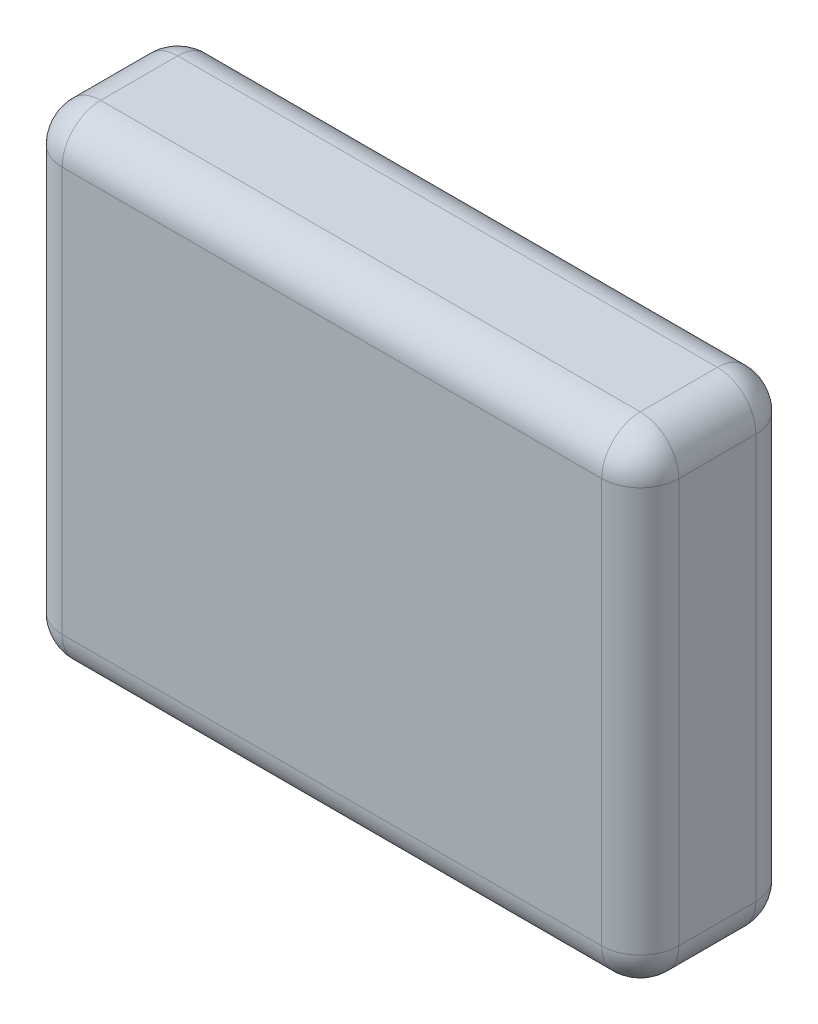
ISO-10303-21;
HEADER;
FILE_DESCRIPTION(('STEP AP214'),'2;1');
FILE_NAME('part.step','',(''),(''),'','','');
FILE_SCHEMA(('AUTOMOTIVE_DESIGN { 1 0 10303 214 1 1 1 1 }'));
ENDSEC;
DATA;
#1=APPLICATION_CONTEXT('core data for automotive mechanical design processes');
#2=APPLICATION_PROTOCOL_DEFINITION('international standard','automotive_design',2000,#1);
#3=PRODUCT_CONTEXT('',#1,'mechanical');
#4=PRODUCT('Part','Part','',(#3));
#5=PRODUCT_RELATED_PRODUCT_CATEGORY('part','',(#4));
#6=PRODUCT_DEFINITION_FORMATION('','',#4);
#7=PRODUCT_DEFINITION_CONTEXT('part definition',#1,'design');
#8=PRODUCT_DEFINITION('design','',#6,#7);
#9=PRODUCT_DEFINITION_SHAPE('','',#8);
#10=(LENGTH_UNIT() NAMED_UNIT(*) SI_UNIT(.MILLI.,.METRE.));
#11=(NAMED_UNIT(*) PLANE_ANGLE_UNIT() SI_UNIT($,.RADIAN.));
#12=(NAMED_UNIT(*) SI_UNIT($,.STERADIAN.) SOLID_ANGLE_UNIT());
#13=UNCERTAINTY_MEASURE_WITH_UNIT(LENGTH_MEASURE(1.E-05),#10,'distance_accuracy_value','');
#14=(GEOMETRIC_REPRESENTATION_CONTEXT(3) GLOBAL_UNCERTAINTY_ASSIGNED_CONTEXT((#13)) GLOBAL_UNIT_ASSIGNED_CONTEXT((#10,
#11,#12)) REPRESENTATION_CONTEXT('',''));
#15=CARTESIAN_POINT('',(0.,0.,0.));
#16=DIRECTION('',(0.,0.,1.));
#17=DIRECTION('',(1.,0.,0.));
#18=AXIS2_PLACEMENT_3D('',#15,#16,#17);
#19=CARTESIAN_POINT('',(14.,18.5,12.));
#20=DIRECTION('',(0.,-1.,0.));
#21=DIRECTION('',(1.,0.,0.));
#22=AXIS2_PLACEMENT_3D('',#19,#20,#21);
#23=SPHERICAL_SURFACE('',#22,2.);
#24=CARTESIAN_POINT('',(14.,18.5,12.));
#25=DIRECTION('',(0.,0.,-1.));
#26=DIRECTION('',(1.,0.,0.));
#27=AXIS2_PLACEMENT_3D('',#24,#25,#26);
#28=CIRCLE('',#27,2.);
#29=CARTESIAN_POINT('',(14.,20.5,12.));
#30=VERTEX_POINT('',#29);
#31=CARTESIAN_POINT('',(16.,18.5,12.));
#32=VERTEX_POINT('',#31);
#33=EDGE_CURVE('E10',#30,#32,#28,.T.);
#34=ORIENTED_EDGE('',*,*,#33,.F.);
#35=CARTESIAN_POINT('',(14.,18.5,12.));
#36=DIRECTION('',(1.,0.,0.));
#37=DIRECTION('',(0.,0.,1.));
#38=AXIS2_PLACEMENT_3D('',#35,#36,#37);
#39=CIRCLE('',#38,2.);
#40=CARTESIAN_POINT('',(14.,18.5,14.));
#41=VERTEX_POINT('',#40);
#42=EDGE_CURVE('E228',#30,#41,#39,.T.);
#43=ORIENTED_EDGE('',*,*,#42,.T.);
#44=CARTESIAN_POINT('',(14.,18.5,12.));
#45=DIRECTION('',(0.,-1.,0.));
#46=DIRECTION('',(1.,0.,0.));
#47=AXIS2_PLACEMENT_3D('',#44,#45,#46);
#48=CIRCLE('',#47,2.);
#49=EDGE_CURVE('E236',#32,#41,#48,.T.);
#50=ORIENTED_EDGE('',*,*,#49,.F.);
#51=EDGE_LOOP('',(#34,#43,#50));
#52=FACE_BOUND('',#51,.T.);
#53=ADVANCED_FACE('F16',(#52),#23,.T.);
#54=CARTESIAN_POINT('',(14.,18.5,8.));
#55=DIRECTION('',(0.,0.,1.));
#56=DIRECTION('',(1.,0.,0.));
#57=AXIS2_PLACEMENT_3D('',#54,#55,#56);
#58=SPHERICAL_SURFACE('',#57,2.);
#59=CARTESIAN_POINT('',(14.,18.5,8.));
#60=DIRECTION('',(0.,-1.,0.));
#61=DIRECTION('',(1.,0.,0.));
#62=AXIS2_PLACEMENT_3D('',#59,#60,#61);
#63=CIRCLE('',#62,2.);
#64=CARTESIAN_POINT('',(14.,18.5,6.));
#65=VERTEX_POINT('',#64);
#66=CARTESIAN_POINT('',(16.,18.5,8.));
#67=VERTEX_POINT('',#66);
#68=EDGE_CURVE('E130',#65,#67,#63,.T.);
#69=ORIENTED_EDGE('',*,*,#68,.F.);
#70=CARTESIAN_POINT('',(14.,18.5,8.));
#71=DIRECTION('',(1.,0.,0.));
#72=DIRECTION('',(0.,1.,0.));
#73=AXIS2_PLACEMENT_3D('',#70,#71,#72);
#74=CIRCLE('',#73,2.);
#75=CARTESIAN_POINT('',(14.,20.5,8.));
#76=VERTEX_POINT('',#75);
#77=EDGE_CURVE('E133',#65,#76,#74,.T.);
#78=ORIENTED_EDGE('',*,*,#77,.T.);
#79=CARTESIAN_POINT('',(14.,18.5,8.));
#80=DIRECTION('',(0.,0.,1.));
#81=DIRECTION('',(1.,0.,0.));
#82=AXIS2_PLACEMENT_3D('',#79,#80,#81);
#83=CIRCLE('',#82,2.);
#84=EDGE_CURVE('E24',#67,#76,#83,.T.);
#85=ORIENTED_EDGE('',*,*,#84,.F.);
#86=EDGE_LOOP('',(#69,#78,#85));
#87=FACE_BOUND('',#86,.T.);
#88=ADVANCED_FACE('F132',(#87),#58,.T.);
#89=CARTESIAN_POINT('',(16.,-4.5,6.));
#90=DIRECTION('',(1.,0.,0.));
#91=DIRECTION('',(0.,1.,0.));
#92=AXIS2_PLACEMENT_3D('',#89,#90,#91);
#93=PLANE('',#92);
#94=DIRECTION('',(0.,0.,1.));
#95=VECTOR('',#94,1.);
#96=CARTESIAN_POINT('',(16.,-2.5,6.));
#97=LINE('',#96,#95);
#98=CARTESIAN_POINT('',(16.,-2.5,8.));
#99=VERTEX_POINT('',#98);
#100=CARTESIAN_POINT('',(16.,-2.5,12.));
#101=VERTEX_POINT('',#100);
#102=EDGE_CURVE('E151',#99,#101,#97,.T.);
#103=ORIENTED_EDGE('',*,*,#102,.F.);
#104=DIRECTION('',(0.,1.,0.));
#105=VECTOR('',#104,1.);
#106=CARTESIAN_POINT('',(16.,-4.5,8.));
#107=LINE('',#106,#105);
#108=EDGE_CURVE('E138',#99,#67,#107,.T.);
#109=ORIENTED_EDGE('',*,*,#108,.T.);
#110=DIRECTION('',(0.,0.,1.));
#111=VECTOR('',#110,1.);
#112=CARTESIAN_POINT('',(16.,18.5,6.));
#113=LINE('',#112,#111);
#114=EDGE_CURVE('E241',#67,#32,#113,.T.);
#115=ORIENTED_EDGE('',*,*,#114,.T.);
#116=DIRECTION('',(0.,1.,0.));
#117=VECTOR('',#116,1.);
#118=CARTESIAN_POINT('',(16.,-4.5,12.));
#119=LINE('',#118,#117);
#120=EDGE_CURVE('E232',#101,#32,#119,.T.);
#121=ORIENTED_EDGE('',*,*,#120,.F.);
#122=EDGE_LOOP('',(#103,#109,#115,#121));
#123=FACE_BOUND('',#122,.T.);
#124=ADVANCED_FACE('F379',(#123),#93,.T.);
#125=CARTESIAN_POINT('',(14.,-2.5,12.));
#126=DIRECTION('',(0.,0.,-1.));
#127=DIRECTION('',(1.,0.,0.));
#128=AXIS2_PLACEMENT_3D('',#125,#126,#127);
#129=SPHERICAL_SURFACE('',#128,2.);
#130=CARTESIAN_POINT('',(14.,-2.5,12.));
#131=DIRECTION('',(0.,1.,0.));
#132=DIRECTION('',(1.,0.,0.));
#133=AXIS2_PLACEMENT_3D('',#130,#131,#132);
#134=CIRCLE('',#133,2.);
#135=CARTESIAN_POINT('',(14.,-2.5,14.));
#136=VERTEX_POINT('',#135);
#137=EDGE_CURVE('E239',#136,#101,#134,.T.);
#138=ORIENTED_EDGE('',*,*,#137,.F.);
#139=CARTESIAN_POINT('',(14.,-2.5,12.));
#140=DIRECTION('',(1.,0.,0.));
#141=DIRECTION('',(0.,-1.,0.));
#142=AXIS2_PLACEMENT_3D('',#139,#140,#141);
#143=CIRCLE('',#142,2.);
#144=CARTESIAN_POINT('',(14.,-4.5,12.));
#145=VERTEX_POINT('',#144);
#146=EDGE_CURVE('E210',#136,#145,#143,.T.);
#147=ORIENTED_EDGE('',*,*,#146,.T.);
#148=CARTESIAN_POINT('',(14.,-2.5,12.));
#149=DIRECTION('',(0.,0.,-1.));
#150=DIRECTION('',(1.,0.,0.));
#151=AXIS2_PLACEMENT_3D('',#148,#149,#150);
#152=CIRCLE('',#151,2.);
#153=EDGE_CURVE('E214',#101,#145,#152,.T.);
#154=ORIENTED_EDGE('',*,*,#153,.F.);
#155=EDGE_LOOP('',(#138,#147,#154));
#156=FACE_BOUND('',#155,.T.);
#157=ADVANCED_FACE('F306',(#156),#129,.T.);
#158=CARTESIAN_POINT('',(14.,-2.5,8.));
#159=DIRECTION('',(0.,0.,1.));
#160=DIRECTION('',(1.,0.,0.));
#161=AXIS2_PLACEMENT_3D('',#158,#159,#160);
#162=SPHERICAL_SURFACE('',#161,2.);
#163=CARTESIAN_POINT('',(14.,-2.5,8.));
#164=DIRECTION('',(0.,0.,-1.));
#165=DIRECTION('',(1.,0.,0.));
#166=AXIS2_PLACEMENT_3D('',#163,#164,#165);
#167=CIRCLE('',#166,2.);
#168=CARTESIAN_POINT('',(14.,-4.5,8.));
#169=VERTEX_POINT('',#168);
#170=EDGE_CURVE('E217',#99,#169,#167,.T.);
#171=ORIENTED_EDGE('',*,*,#170,.T.);
#172=CARTESIAN_POINT('',(14.,-2.5,8.));
#173=DIRECTION('',(-1.,0.,0.));
#174=DIRECTION('',(0.,-1.,0.));
#175=AXIS2_PLACEMENT_3D('',#172,#173,#174);
#176=CIRCLE('',#175,2.);
#177=CARTESIAN_POINT('',(14.,-2.5,6.));
#178=VERTEX_POINT('',#177);
#179=EDGE_CURVE('E206',#178,#169,#176,.T.);
#180=ORIENTED_EDGE('',*,*,#179,.F.);
#181=CARTESIAN_POINT('',(14.,-2.5,8.));
#182=DIRECTION('',(0.,-1.,0.));
#183=DIRECTION('',(1.,0.,0.));
#184=AXIS2_PLACEMENT_3D('',#181,#182,#183);
#185=CIRCLE('',#184,2.);
#186=EDGE_CURVE('E139',#178,#99,#185,.T.);
#187=ORIENTED_EDGE('',*,*,#186,.T.);
#188=EDGE_LOOP('',(#171,#180,#187));
#189=FACE_BOUND('',#188,.T.);
#190=ADVANCED_FACE('F378',(#189),#162,.T.);
#191=CARTESIAN_POINT('',(14.,18.5,6.));
#192=DIRECTION('',(0.,0.,1.));
#193=DIRECTION('',(1.,0.,0.));
#194=AXIS2_PLACEMENT_3D('',#191,#192,#193);
#195=CYLINDRICAL_SURFACE('',#194,2.);
#196=ORIENTED_EDGE('',*,*,#114,.F.);
#197=ORIENTED_EDGE('',*,*,#84,.T.);
#198=DIRECTION('',(0.,0.,1.));
#199=VECTOR('',#198,1.);
#200=CARTESIAN_POINT('',(14.,20.5,6.));
#201=LINE('',#200,#199);
#202=EDGE_CURVE('E201',#76,#30,#201,.T.);
#203=ORIENTED_EDGE('',*,*,#202,.T.);
#204=ORIENTED_EDGE('',*,*,#33,.T.);
#205=EDGE_LOOP('',(#196,#197,#203,#204));
#206=FACE_BOUND('',#205,.T.);
#207=ADVANCED_FACE('F453',(#206),#195,.T.);
#208=CARTESIAN_POINT('',(14.,-4.5,12.));
#209=DIRECTION('',(0.,1.,0.));
#210=DIRECTION('',(1.,0.,0.));
#211=AXIS2_PLACEMENT_3D('',#208,#209,#210);
#212=CYLINDRICAL_SURFACE('',#211,2.);
#213=ORIENTED_EDGE('',*,*,#120,.T.);
#214=ORIENTED_EDGE('',*,*,#49,.T.);
#215=DIRECTION('',(0.,1.,0.));
#216=VECTOR('',#215,1.);
#217=CARTESIAN_POINT('',(14.,-4.5,14.));
#218=LINE('',#217,#216);
#219=EDGE_CURVE('E186',#136,#41,#218,.T.);
#220=ORIENTED_EDGE('',*,*,#219,.F.);
#221=ORIENTED_EDGE('',*,*,#137,.T.);
#222=EDGE_LOOP('',(#213,#214,#220,#221));
#223=FACE_BOUND('',#222,.T.);
#224=ADVANCED_FACE('F381',(#223),#212,.T.);
#225=CARTESIAN_POINT('',(-16.,18.5,12.));
#226=DIRECTION('',(1.,0.,0.));
#227=DIRECTION('',(0.,1.,0.));
#228=AXIS2_PLACEMENT_3D('',#225,#226,#227);
#229=CYLINDRICAL_SURFACE('',#228,2.);
#230=CARTESIAN_POINT('',(-14.,18.5,12.));
#231=DIRECTION('',(1.,0.,0.));
#232=DIRECTION('',(0.,0.,1.));
#233=AXIS2_PLACEMENT_3D('',#230,#231,#232);
#234=CIRCLE('',#233,2.);
#235=CARTESIAN_POINT('',(-14.,20.5,12.));
#236=VERTEX_POINT('',#235);
#237=CARTESIAN_POINT('',(-14.,18.5,14.));
#238=VERTEX_POINT('',#237);
#239=EDGE_CURVE('E194',#236,#238,#234,.T.);
#240=ORIENTED_EDGE('',*,*,#239,.T.);
#241=DIRECTION('',(1.,0.,0.));
#242=VECTOR('',#241,1.);
#243=CARTESIAN_POINT('',(-16.,18.5,14.));
#244=LINE('',#243,#242);
#245=EDGE_CURVE('E190',#238,#41,#244,.T.);
#246=ORIENTED_EDGE('',*,*,#245,.T.);
#247=ORIENTED_EDGE('',*,*,#42,.F.);
#248=DIRECTION('',(1.,0.,0.));
#249=VECTOR('',#248,1.);
#250=CARTESIAN_POINT('',(-16.,20.5,12.));
#251=LINE('',#250,#249);
#252=EDGE_CURVE('E197',#236,#30,#251,.T.);
#253=ORIENTED_EDGE('',*,*,#252,.F.);
#254=EDGE_LOOP('',(#240,#246,#247,#253));
#255=FACE_BOUND('',#254,.T.);
#256=ADVANCED_FACE('F385',(#255),#229,.T.);
#257=CARTESIAN_POINT('',(14.,-4.5,8.));
#258=DIRECTION('',(0.,1.,0.));
#259=DIRECTION('',(1.,0.,0.));
#260=AXIS2_PLACEMENT_3D('',#257,#258,#259);
#261=CYLINDRICAL_SURFACE('',#260,2.);
#262=ORIENTED_EDGE('',*,*,#186,.F.);
#263=DIRECTION('',(0.,1.,0.));
#264=VECTOR('',#263,1.);
#265=CARTESIAN_POINT('',(14.,-4.5,6.));
#266=LINE('',#265,#264);
#267=EDGE_CURVE('E154',#178,#65,#266,.T.);
#268=ORIENTED_EDGE('',*,*,#267,.T.);
#269=ORIENTED_EDGE('',*,*,#68,.T.);
#270=ORIENTED_EDGE('',*,*,#108,.F.);
#271=EDGE_LOOP('',(#262,#268,#269,#270));
#272=FACE_BOUND('',#271,.T.);
#273=ADVANCED_FACE('F155',(#272),#261,.T.);
#274=CARTESIAN_POINT('',(-16.,18.5,8.));
#275=DIRECTION('',(1.,0.,0.));
#276=DIRECTION('',(0.,1.,0.));
#277=AXIS2_PLACEMENT_3D('',#274,#275,#276);
#278=CYLINDRICAL_SURFACE('',#277,2.);
#279=DIRECTION('',(1.,0.,0.));
#280=VECTOR('',#279,1.);
#281=CARTESIAN_POINT('',(-16.,20.5,8.));
#282=LINE('',#281,#280);
#283=CARTESIAN_POINT('',(-14.,20.5,8.));
#284=VERTEX_POINT('',#283);
#285=EDGE_CURVE('E148',#284,#76,#282,.T.);
#286=ORIENTED_EDGE('',*,*,#285,.T.);
#287=ORIENTED_EDGE('',*,*,#77,.F.);
#288=DIRECTION('',(1.,0.,0.));
#289=VECTOR('',#288,1.);
#290=CARTESIAN_POINT('',(-16.,18.5,6.));
#291=LINE('',#290,#289);
#292=CARTESIAN_POINT('',(-14.,18.5,6.));
#293=VERTEX_POINT('',#292);
#294=EDGE_CURVE('E146',#293,#65,#291,.T.);
#295=ORIENTED_EDGE('',*,*,#294,.F.);
#296=CARTESIAN_POINT('',(-14.,18.5,8.));
#297=DIRECTION('',(1.,0.,0.));
#298=DIRECTION('',(0.,1.,0.));
#299=AXIS2_PLACEMENT_3D('',#296,#297,#298);
#300=CIRCLE('',#299,2.);
#301=EDGE_CURVE('E182',#293,#284,#300,.T.);
#302=ORIENTED_EDGE('',*,*,#301,.T.);
#303=EDGE_LOOP('',(#286,#287,#295,#302));
#304=FACE_BOUND('',#303,.T.);
#305=ADVANCED_FACE('F143',(#304),#278,.T.);
#306=CARTESIAN_POINT('',(14.,-2.5,6.));
#307=DIRECTION('',(0.,0.,1.));
#308=DIRECTION('',(1.,0.,0.));
#309=AXIS2_PLACEMENT_3D('',#306,#307,#308);
#310=CYLINDRICAL_SURFACE('',#309,2.);
#311=ORIENTED_EDGE('',*,*,#153,.T.);
#312=DIRECTION('',(0.,0.,1.));
#313=VECTOR('',#312,1.);
#314=CARTESIAN_POINT('',(14.,-4.5,6.));
#315=LINE('',#314,#313);
#316=EDGE_CURVE('E174',#169,#145,#315,.T.);
#317=ORIENTED_EDGE('',*,*,#316,.F.);
#318=ORIENTED_EDGE('',*,*,#170,.F.);
#319=ORIENTED_EDGE('',*,*,#102,.T.);
#320=EDGE_LOOP('',(#311,#317,#318,#319));
#321=FACE_BOUND('',#320,.T.);
#322=ADVANCED_FACE('F301',(#321),#310,.T.);
#323=CARTESIAN_POINT('',(-16.,-2.5,12.));
#324=DIRECTION('',(1.,0.,0.));
#325=DIRECTION('',(0.,-1.,0.));
#326=AXIS2_PLACEMENT_3D('',#323,#324,#325);
#327=CYLINDRICAL_SURFACE('',#326,2.);
#328=DIRECTION('',(1.,0.,0.));
#329=VECTOR('',#328,1.);
#330=CARTESIAN_POINT('',(-16.,-4.5,12.));
#331=LINE('',#330,#329);
#332=CARTESIAN_POINT('',(-14.,-4.5,12.));
#333=VERTEX_POINT('',#332);
#334=EDGE_CURVE('E167',#333,#145,#331,.T.);
#335=ORIENTED_EDGE('',*,*,#334,.T.);
#336=ORIENTED_EDGE('',*,*,#146,.F.);
#337=DIRECTION('',(1.,0.,0.));
#338=VECTOR('',#337,1.);
#339=CARTESIAN_POINT('',(-16.,-2.5,14.));
#340=LINE('',#339,#338);
#341=CARTESIAN_POINT('',(-14.,-2.5,14.));
#342=VERTEX_POINT('',#341);
#343=EDGE_CURVE('E185',#342,#136,#340,.T.);
#344=ORIENTED_EDGE('',*,*,#343,.F.);
#345=CARTESIAN_POINT('',(-14.,-2.5,12.));
#346=DIRECTION('',(1.,0.,0.));
#347=DIRECTION('',(0.,-1.,0.));
#348=AXIS2_PLACEMENT_3D('',#345,#346,#347);
#349=CIRCLE('',#348,2.);
#350=EDGE_CURVE('E283',#342,#333,#349,.T.);
#351=ORIENTED_EDGE('',*,*,#350,.T.);
#352=EDGE_LOOP('',(#335,#336,#344,#351));
#353=FACE_BOUND('',#352,.T.);
#354=ADVANCED_FACE('F309',(#353),#327,.T.);
#355=CARTESIAN_POINT('',(-16.,-2.5,8.));
#356=DIRECTION('',(1.,0.,0.));
#357=DIRECTION('',(0.,-1.,0.));
#358=AXIS2_PLACEMENT_3D('',#355,#356,#357);
#359=CYLINDRICAL_SURFACE('',#358,2.);
#360=CARTESIAN_POINT('',(-14.,-2.5,8.));
#361=DIRECTION('',(-1.,0.,0.));
#362=DIRECTION('',(0.,-1.,0.));
#363=AXIS2_PLACEMENT_3D('',#360,#361,#362);
#364=CIRCLE('',#363,2.);
#365=CARTESIAN_POINT('',(-14.,-2.5,6.));
#366=VERTEX_POINT('',#365);
#367=CARTESIAN_POINT('',(-14.,-4.5,8.));
#368=VERTEX_POINT('',#367);
#369=EDGE_CURVE('E279',#366,#368,#364,.T.);
#370=ORIENTED_EDGE('',*,*,#369,.F.);
#371=DIRECTION('',(1.,0.,0.));
#372=VECTOR('',#371,1.);
#373=CARTESIAN_POINT('',(-16.,-2.5,6.));
#374=LINE('',#373,#372);
#375=EDGE_CURVE('E160',#366,#178,#374,.T.);
#376=ORIENTED_EDGE('',*,*,#375,.T.);
#377=ORIENTED_EDGE('',*,*,#179,.T.);
#378=DIRECTION('',(1.,0.,0.));
#379=VECTOR('',#378,1.);
#380=CARTESIAN_POINT('',(-16.,-4.5,8.));
#381=LINE('',#380,#379);
#382=EDGE_CURVE('E286',#368,#169,#381,.T.);
#383=ORIENTED_EDGE('',*,*,#382,.F.);
#384=EDGE_LOOP('',(#370,#376,#377,#383));
#385=FACE_BOUND('',#384,.T.);
#386=ADVANCED_FACE('F376',(#385),#359,.T.);
#387=CARTESIAN_POINT('',(-16.,20.5,6.));
#388=DIRECTION('',(0.,1.,0.));
#389=DIRECTION('',(1.,0.,0.));
#390=AXIS2_PLACEMENT_3D('',#387,#388,#389);
#391=PLANE('',#390);
#392=DIRECTION('',(0.,0.,1.));
#393=VECTOR('',#392,1.);
#394=CARTESIAN_POINT('',(-14.,20.5,6.));
#395=LINE('',#394,#393);
#396=EDGE_CURVE('E274',#284,#236,#395,.T.);
#397=ORIENTED_EDGE('',*,*,#396,.T.);
#398=ORIENTED_EDGE('',*,*,#252,.T.);
#399=ORIENTED_EDGE('',*,*,#202,.F.);
#400=ORIENTED_EDGE('',*,*,#285,.F.);
#401=EDGE_LOOP('',(#397,#398,#399,#400));
#402=FACE_BOUND('',#401,.T.);
#403=ADVANCED_FACE('F392',(#402),#391,.T.);
#404=CARTESIAN_POINT('',(-14.,18.5,12.));
#405=DIRECTION('',(0.,-1.,0.));
#406=DIRECTION('',(-1.,0.,0.));
#407=AXIS2_PLACEMENT_3D('',#404,#405,#406);
#408=SPHERICAL_SURFACE('',#407,2.);
#409=CARTESIAN_POINT('',(-14.,18.5,12.));
#410=DIRECTION('',(0.,1.,0.));
#411=DIRECTION('',(-1.,0.,0.));
#412=AXIS2_PLACEMENT_3D('',#409,#410,#411);
#413=CIRCLE('',#412,2.);
#414=CARTESIAN_POINT('',(-16.,18.5,12.));
#415=VERTEX_POINT('',#414);
#416=EDGE_CURVE('E332',#415,#238,#413,.T.);
#417=ORIENTED_EDGE('',*,*,#416,.T.);
#418=ORIENTED_EDGE('',*,*,#239,.F.);
#419=CARTESIAN_POINT('',(-14.,18.5,12.));
#420=DIRECTION('',(0.,0.,1.));
#421=DIRECTION('',(-1.,0.,0.));
#422=AXIS2_PLACEMENT_3D('',#419,#420,#421);
#423=CIRCLE('',#422,2.);
#424=EDGE_CURVE('E278',#236,#415,#423,.T.);
#425=ORIENTED_EDGE('',*,*,#424,.T.);
#426=EDGE_LOOP('',(#417,#418,#425));
#427=FACE_BOUND('',#426,.T.);
#428=ADVANCED_FACE('F388',(#427),#408,.T.);
#429=CARTESIAN_POINT('',(-16.,-4.5,14.));
#430=DIRECTION('',(0.,0.,1.));
#431=DIRECTION('',(1.,0.,0.));
#432=AXIS2_PLACEMENT_3D('',#429,#430,#431);
#433=PLANE('',#432);
#434=DIRECTION('',(0.,1.,0.));
#435=VECTOR('',#434,1.);
#436=CARTESIAN_POINT('',(-14.,-4.5,14.));
#437=LINE('',#436,#435);
#438=EDGE_CURVE('E273',#342,#238,#437,.T.);
#439=ORIENTED_EDGE('',*,*,#438,.F.);
#440=ORIENTED_EDGE('',*,*,#343,.T.);
#441=ORIENTED_EDGE('',*,*,#219,.T.);
#442=ORIENTED_EDGE('',*,*,#245,.F.);
#443=EDGE_LOOP('',(#439,#440,#441,#442));
#444=FACE_BOUND('',#443,.T.);
#445=ADVANCED_FACE('F359',(#444),#433,.T.);
#446=CARTESIAN_POINT('',(-14.,18.5,8.));
#447=DIRECTION('',(0.,0.,1.));
#448=DIRECTION('',(-1.,0.,0.));
#449=AXIS2_PLACEMENT_3D('',#446,#447,#448);
#450=SPHERICAL_SURFACE('',#449,2.);
#451=CARTESIAN_POINT('',(-14.,18.5,8.));
#452=DIRECTION('',(0.,0.,-1.));
#453=DIRECTION('',(-1.,0.,0.));
#454=AXIS2_PLACEMENT_3D('',#451,#452,#453);
#455=CIRCLE('',#454,2.);
#456=CARTESIAN_POINT('',(-16.,18.5,8.));
#457=VERTEX_POINT('',#456);
#458=EDGE_CURVE('E254',#457,#284,#455,.T.);
#459=ORIENTED_EDGE('',*,*,#458,.T.);
#460=ORIENTED_EDGE('',*,*,#301,.F.);
#461=CARTESIAN_POINT('',(-14.,18.5,8.));
#462=DIRECTION('',(0.,1.,0.));
#463=DIRECTION('',(-1.,0.,0.));
#464=AXIS2_PLACEMENT_3D('',#461,#462,#463);
#465=CIRCLE('',#464,2.);
#466=EDGE_CURVE('E260',#293,#457,#465,.T.);
#467=ORIENTED_EDGE('',*,*,#466,.T.);
#468=EDGE_LOOP('',(#459,#460,#467));
#469=FACE_BOUND('',#468,.T.);
#470=ADVANCED_FACE('F398',(#469),#450,.T.);
#471=CARTESIAN_POINT('',(-16.,-4.5,6.));
#472=DIRECTION('',(0.,0.,1.));
#473=DIRECTION('',(1.,0.,0.));
#474=AXIS2_PLACEMENT_3D('',#471,#472,#473);
#475=PLANE('',#474);
#476=ORIENTED_EDGE('',*,*,#294,.T.);
#477=ORIENTED_EDGE('',*,*,#267,.F.);
#478=ORIENTED_EDGE('',*,*,#375,.F.);
#479=DIRECTION('',(0.,1.,0.));
#480=VECTOR('',#479,1.);
#481=CARTESIAN_POINT('',(-14.,-4.5,6.));
#482=LINE('',#481,#480);
#483=EDGE_CURVE('E164',#366,#293,#482,.T.);
#484=ORIENTED_EDGE('',*,*,#483,.T.);
#485=EDGE_LOOP('',(#476,#477,#478,#484));
#486=FACE_BOUND('',#485,.T.);
#487=ADVANCED_FACE('F162',(#486),#475,.F.);
#488=CARTESIAN_POINT('',(-16.,-4.5,6.));
#489=DIRECTION('',(0.,1.,0.));
#490=DIRECTION('',(1.,0.,0.));
#491=AXIS2_PLACEMENT_3D('',#488,#489,#490);
#492=PLANE('',#491);
#493=ORIENTED_EDGE('',*,*,#382,.T.);
#494=ORIENTED_EDGE('',*,*,#316,.T.);
#495=ORIENTED_EDGE('',*,*,#334,.F.);
#496=DIRECTION('',(0.,0.,1.));
#497=VECTOR('',#496,1.);
#498=CARTESIAN_POINT('',(-14.,-4.5,6.));
#499=LINE('',#498,#497);
#500=EDGE_CURVE('E261',#368,#333,#499,.T.);
#501=ORIENTED_EDGE('',*,*,#500,.F.);
#502=EDGE_LOOP('',(#493,#494,#495,#501));
#503=FACE_BOUND('',#502,.T.);
#504=ADVANCED_FACE('F298',(#503),#492,.F.);
#505=CARTESIAN_POINT('',(-14.,-2.5,12.));
#506=DIRECTION('',(0.,0.,-1.));
#507=DIRECTION('',(-1.,0.,0.));
#508=AXIS2_PLACEMENT_3D('',#505,#506,#507);
#509=SPHERICAL_SURFACE('',#508,2.);
#510=CARTESIAN_POINT('',(-14.,-2.5,12.));
#511=DIRECTION('',(0.,0.,1.));
#512=DIRECTION('',(-1.,0.,0.));
#513=AXIS2_PLACEMENT_3D('',#510,#511,#512);
#514=CIRCLE('',#513,2.);
#515=CARTESIAN_POINT('',(-16.,-2.5,12.));
#516=VERTEX_POINT('',#515);
#517=EDGE_CURVE('E256',#516,#333,#514,.T.);
#518=ORIENTED_EDGE('',*,*,#517,.T.);
#519=ORIENTED_EDGE('',*,*,#350,.F.);
#520=CARTESIAN_POINT('',(-14.,-2.5,12.));
#521=DIRECTION('',(0.,-1.,0.));
#522=DIRECTION('',(-1.,0.,0.));
#523=AXIS2_PLACEMENT_3D('',#520,#521,#522);
#524=CIRCLE('',#523,2.);
#525=EDGE_CURVE('E264',#342,#516,#524,.T.);
#526=ORIENTED_EDGE('',*,*,#525,.T.);
#527=EDGE_LOOP('',(#518,#519,#526));
#528=FACE_BOUND('',#527,.T.);
#529=ADVANCED_FACE('F316',(#528),#509,.T.);
#530=CARTESIAN_POINT('',(-14.,-2.5,8.));
#531=DIRECTION('',(0.,0.,1.));
#532=DIRECTION('',(-1.,0.,0.));
#533=AXIS2_PLACEMENT_3D('',#530,#531,#532);
#534=SPHERICAL_SURFACE('',#533,2.);
#535=CARTESIAN_POINT('',(-14.,-2.5,8.));
#536=DIRECTION('',(0.,1.,0.));
#537=DIRECTION('',(-1.,0.,0.));
#538=AXIS2_PLACEMENT_3D('',#535,#536,#537);
#539=CIRCLE('',#538,2.);
#540=CARTESIAN_POINT('',(-16.,-2.5,8.));
#541=VERTEX_POINT('',#540);
#542=EDGE_CURVE('E262',#366,#541,#539,.T.);
#543=ORIENTED_EDGE('',*,*,#542,.F.);
#544=ORIENTED_EDGE('',*,*,#369,.T.);
#545=CARTESIAN_POINT('',(-14.,-2.5,8.));
#546=DIRECTION('',(0.,0.,1.));
#547=DIRECTION('',(-1.,0.,0.));
#548=AXIS2_PLACEMENT_3D('',#545,#546,#547);
#549=CIRCLE('',#548,2.);
#550=EDGE_CURVE('E324',#541,#368,#549,.T.);
#551=ORIENTED_EDGE('',*,*,#550,.F.);
#552=EDGE_LOOP('',(#543,#544,#551));
#553=FACE_BOUND('',#552,.T.);
#554=ADVANCED_FACE('F373',(#553),#534,.T.);
#555=CARTESIAN_POINT('',(-14.,18.5,6.));
#556=DIRECTION('',(0.,0.,1.));
#557=DIRECTION('',(-1.,0.,0.));
#558=AXIS2_PLACEMENT_3D('',#555,#556,#557);
#559=CYLINDRICAL_SURFACE('',#558,2.);
#560=ORIENTED_EDGE('',*,*,#424,.F.);
#561=ORIENTED_EDGE('',*,*,#396,.F.);
#562=ORIENTED_EDGE('',*,*,#458,.F.);
#563=DIRECTION('',(0.,0.,1.));
#564=VECTOR('',#563,1.);
#565=CARTESIAN_POINT('',(-16.,18.5,6.));
#566=LINE('',#565,#564);
#567=EDGE_CURVE('E342',#457,#415,#566,.T.);
#568=ORIENTED_EDGE('',*,*,#567,.T.);
#569=EDGE_LOOP('',(#560,#561,#562,#568));
#570=FACE_BOUND('',#569,.T.);
#571=ADVANCED_FACE('F394',(#570),#559,.T.);
#572=CARTESIAN_POINT('',(-14.,-4.5,12.));
#573=DIRECTION('',(0.,1.,0.));
#574=DIRECTION('',(-1.,0.,0.));
#575=AXIS2_PLACEMENT_3D('',#572,#573,#574);
#576=CYLINDRICAL_SURFACE('',#575,2.);
#577=ORIENTED_EDGE('',*,*,#525,.F.);
#578=ORIENTED_EDGE('',*,*,#438,.T.);
#579=ORIENTED_EDGE('',*,*,#416,.F.);
#580=DIRECTION('',(0.,1.,0.));
#581=VECTOR('',#580,1.);
#582=CARTESIAN_POINT('',(-16.,-4.5,12.));
#583=LINE('',#582,#581);
#584=EDGE_CURVE('E346',#516,#415,#583,.T.);
#585=ORIENTED_EDGE('',*,*,#584,.F.);
#586=EDGE_LOOP('',(#577,#578,#579,#585));
#587=FACE_BOUND('',#586,.T.);
#588=ADVANCED_FACE('F364',(#587),#576,.T.);
#589=CARTESIAN_POINT('',(-14.,-4.5,8.));
#590=DIRECTION('',(0.,1.,0.));
#591=DIRECTION('',(-1.,0.,0.));
#592=AXIS2_PLACEMENT_3D('',#589,#590,#591);
#593=CYLINDRICAL_SURFACE('',#592,2.);
#594=DIRECTION('',(0.,1.,0.));
#595=VECTOR('',#594,1.);
#596=CARTESIAN_POINT('',(-16.,-4.5,8.));
#597=LINE('',#596,#595);
#598=EDGE_CURVE('E338',#541,#457,#597,.T.);
#599=ORIENTED_EDGE('',*,*,#598,.T.);
#600=ORIENTED_EDGE('',*,*,#466,.F.);
#601=ORIENTED_EDGE('',*,*,#483,.F.);
#602=ORIENTED_EDGE('',*,*,#542,.T.);
#603=EDGE_LOOP('',(#599,#600,#601,#602));
#604=FACE_BOUND('',#603,.T.);
#605=ADVANCED_FACE('F370',(#604),#593,.T.);
#606=CARTESIAN_POINT('',(-14.,-2.5,6.));
#607=DIRECTION('',(0.,0.,1.));
#608=DIRECTION('',(-1.,0.,0.));
#609=AXIS2_PLACEMENT_3D('',#606,#607,#608);
#610=CYLINDRICAL_SURFACE('',#609,2.);
#611=DIRECTION('',(0.,0.,1.));
#612=VECTOR('',#611,1.);
#613=CARTESIAN_POINT('',(-16.,-2.5,6.));
#614=LINE('',#613,#612);
#615=EDGE_CURVE('E329',#541,#516,#614,.T.);
#616=ORIENTED_EDGE('',*,*,#615,.F.);
#617=ORIENTED_EDGE('',*,*,#550,.T.);
#618=ORIENTED_EDGE('',*,*,#500,.T.);
#619=ORIENTED_EDGE('',*,*,#517,.F.);
#620=EDGE_LOOP('',(#616,#617,#618,#619));
#621=FACE_BOUND('',#620,.T.);
#622=ADVANCED_FACE('F322',(#621),#610,.T.);
#623=CARTESIAN_POINT('',(-16.,-4.5,6.));
#624=DIRECTION('',(1.,0.,0.));
#625=DIRECTION('',(0.,1.,0.));
#626=AXIS2_PLACEMENT_3D('',#623,#624,#625);
#627=PLANE('',#626);
#628=ORIENTED_EDGE('',*,*,#584,.T.);
#629=ORIENTED_EDGE('',*,*,#567,.F.);
#630=ORIENTED_EDGE('',*,*,#598,.F.);
#631=ORIENTED_EDGE('',*,*,#615,.T.);
#632=EDGE_LOOP('',(#628,#629,#630,#631));
#633=FACE_BOUND('',#632,.T.);
#634=ADVANCED_FACE('F367',(#633),#627,.F.);
#635=CLOSED_SHELL('',(#53,#88,#124,#157,#190,#207,#224,#256,#273,#305,#322,#354,#386,#403,#428,
#445,#470,#487,#504,#529,#554,#571,#588,#605,#622,#634));
#636=MANIFOLD_SOLID_BREP('B1',#635);
#637=ADVANCED_BREP_SHAPE_REPRESENTATION('',(#18,#636),#14);
#638=SHAPE_DEFINITION_REPRESENTATION(#9,#637);
ENDSEC;
END-ISO-10303-21;
